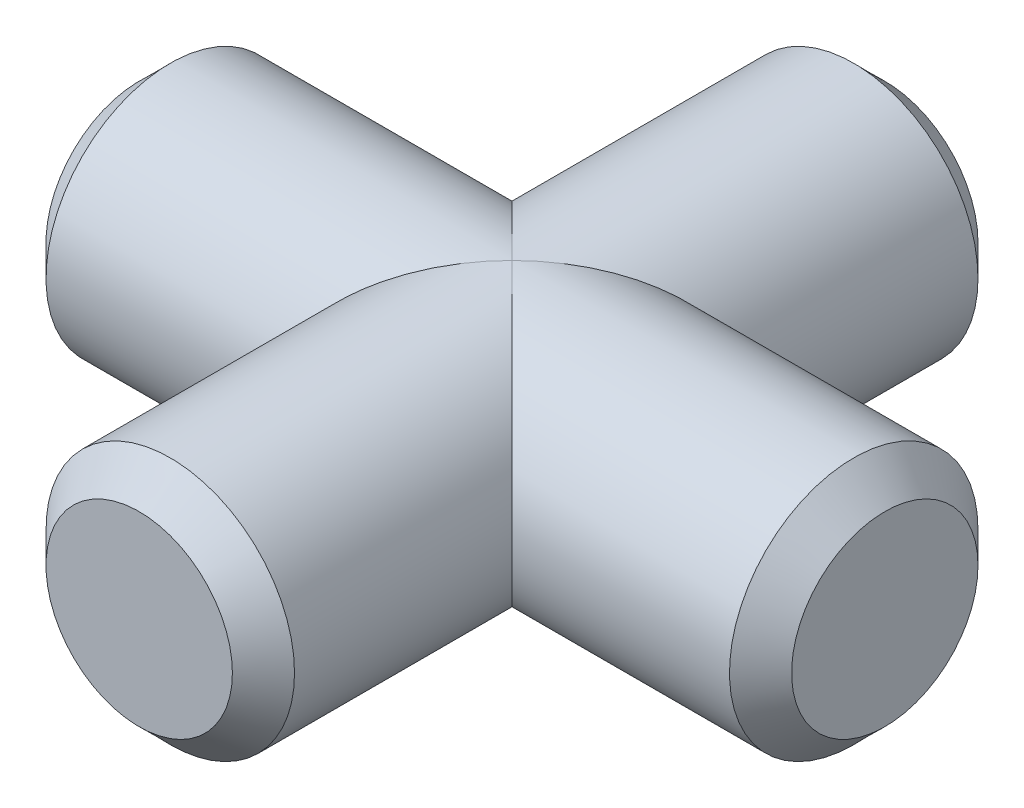
ISO-10303-21;
HEADER;
FILE_DESCRIPTION(('STEP AP214'),'2;1');
FILE_NAME('part.step','',(''),(''),'','','');
FILE_SCHEMA(('AUTOMOTIVE_DESIGN { 1 0 10303 214 1 1 1 1 }'));
ENDSEC;
DATA;
#1=APPLICATION_CONTEXT('core data for automotive mechanical design processes');
#2=APPLICATION_PROTOCOL_DEFINITION('international standard','automotive_design',2000,#1);
#3=PRODUCT_CONTEXT('',#1,'mechanical');
#4=PRODUCT('Part','Part','',(#3));
#5=PRODUCT_RELATED_PRODUCT_CATEGORY('part','',(#4));
#6=PRODUCT_DEFINITION_FORMATION('','',#4);
#7=PRODUCT_DEFINITION_CONTEXT('part definition',#1,'design');
#8=PRODUCT_DEFINITION('design','',#6,#7);
#9=PRODUCT_DEFINITION_SHAPE('','',#8);
#10=(LENGTH_UNIT() NAMED_UNIT(*) SI_UNIT(.MILLI.,.METRE.));
#11=(NAMED_UNIT(*) PLANE_ANGLE_UNIT() SI_UNIT($,.RADIAN.));
#12=(NAMED_UNIT(*) SI_UNIT($,.STERADIAN.) SOLID_ANGLE_UNIT());
#13=UNCERTAINTY_MEASURE_WITH_UNIT(LENGTH_MEASURE(1.E-05),#10,'distance_accuracy_value','');
#14=(GEOMETRIC_REPRESENTATION_CONTEXT(3) GLOBAL_UNCERTAINTY_ASSIGNED_CONTEXT((#13)) GLOBAL_UNIT_ASSIGNED_CONTEXT((#10,
#11,#12)) REPRESENTATION_CONTEXT('',''));
#15=CARTESIAN_POINT('',(0.,0.,0.));
#16=DIRECTION('',(0.,0.,1.));
#17=DIRECTION('',(1.,0.,0.));
#18=AXIS2_PLACEMENT_3D('',#15,#16,#17);
#19=CARTESIAN_POINT('',(0.,0.,12.));
#20=DIRECTION('',(0.,0.,-1.));
#21=DIRECTION('',(-1.,0.,0.));
#22=AXIS2_PLACEMENT_3D('',#19,#20,#21);
#23=CYLINDRICAL_SURFACE('',#22,2.);
#24=CARTESIAN_POINT('',(0.,0.,11.5));
#25=DIRECTION('',(0.,0.,1.));
#26=DIRECTION('',(1.,0.,0.));
#27=AXIS2_PLACEMENT_3D('',#24,#25,#26);
#28=CIRCLE('',#27,2.);
#29=CARTESIAN_POINT('',(2.,0.,11.5));
#30=VERTEX_POINT('',#29);
#31=EDGE_CURVE('E82',#30,#30,#28,.F.);
#32=ORIENTED_EDGE('',*,*,#31,.T.);
#33=EDGE_LOOP('',(#32));
#34=FACE_BOUND('',#33,.T.);
#35=CARTESIAN_POINT('',(0.,0.,6.));
#36=DIRECTION('',(-0.707106781186547,0.,-0.707106781186547));
#37=DIRECTION('',(0.707106781186547,0.,-0.707106781186547));
#38=AXIS2_PLACEMENT_3D('',#35,#36,#37);
#39=ELLIPSE('',#38,2.82842712474619,2.);
#40=CARTESIAN_POINT('',(0.,-2.,6.));
#41=VERTEX_POINT('',#40);
#42=CARTESIAN_POINT('',(0.,2.,6.));
#43=VERTEX_POINT('',#42);
#44=EDGE_CURVE('E54',#41,#43,#39,.T.);
#45=ORIENTED_EDGE('',*,*,#44,.F.);
#46=CARTESIAN_POINT('',(0.,0.,6.));
#47=DIRECTION('',(0.707106781186547,0.,-0.707106781186547));
#48=DIRECTION('',(-0.707106781186547,0.,-0.707106781186547));
#49=AXIS2_PLACEMENT_3D('',#46,#47,#48);
#50=ELLIPSE('',#49,2.82842712474619,2.);
#51=EDGE_CURVE('E53',#43,#41,#50,.T.);
#52=ORIENTED_EDGE('',*,*,#51,.F.);
#53=EDGE_LOOP('',(#45,#52));
#54=FACE_BOUND('',#53,.T.);
#55=ADVANCED_FACE('F33',(#34,#54),#23,.T.);
#56=CARTESIAN_POINT('',(0.,0.,12.));
#57=DIRECTION('',(0.,0.,1.));
#58=DIRECTION('',(1.,0.,0.));
#59=AXIS2_PLACEMENT_3D('',#56,#57,#58);
#60=PLANE('',#59);
#61=CARTESIAN_POINT('',(0.,0.,12.));
#62=DIRECTION('',(0.,0.,1.));
#63=DIRECTION('',(1.,0.,0.));
#64=AXIS2_PLACEMENT_3D('',#61,#62,#63);
#65=CIRCLE('',#64,1.5);
#66=CARTESIAN_POINT('',(1.5,0.,12.));
#67=VERTEX_POINT('',#66);
#68=EDGE_CURVE('E79',#67,#67,#65,.T.);
#69=ORIENTED_EDGE('',*,*,#68,.T.);
#70=EDGE_LOOP('',(#69));
#71=FACE_BOUND('',#70,.T.);
#72=ADVANCED_FACE('F98',(#71),#60,.T.);
#73=CARTESIAN_POINT('',(-6.,0.,6.));
#74=DIRECTION('',(1.,0.,0.));
#75=DIRECTION('',(0.,0.,-1.));
#76=AXIS2_PLACEMENT_3D('',#73,#74,#75);
#77=PLANE('',#76);
#78=CARTESIAN_POINT('',(-6.,0.,6.));
#79=DIRECTION('',(1.,0.,0.));
#80=DIRECTION('',(0.,0.,-1.));
#81=AXIS2_PLACEMENT_3D('',#78,#79,#80);
#82=CIRCLE('',#81,1.5);
#83=CARTESIAN_POINT('',(-6.,0.,4.5));
#84=VERTEX_POINT('',#83);
#85=EDGE_CURVE('E76',#84,#84,#82,.F.);
#86=ORIENTED_EDGE('',*,*,#85,.T.);
#87=EDGE_LOOP('',(#86));
#88=FACE_BOUND('',#87,.T.);
#89=ADVANCED_FACE('F105',(#88),#77,.F.);
#90=CARTESIAN_POINT('',(6.,0.,6.));
#91=DIRECTION('',(-1.,0.,0.));
#92=DIRECTION('',(0.,0.,1.));
#93=AXIS2_PLACEMENT_3D('',#90,#91,#92);
#94=CYLINDRICAL_SURFACE('',#93,2.);
#95=CARTESIAN_POINT('',(-5.5,0.,6.));
#96=DIRECTION('',(1.,0.,0.));
#97=DIRECTION('',(0.,0.,-1.));
#98=AXIS2_PLACEMENT_3D('',#95,#96,#97);
#99=CIRCLE('',#98,2.);
#100=CARTESIAN_POINT('',(-5.5,0.,4.));
#101=VERTEX_POINT('',#100);
#102=EDGE_CURVE('E73',#101,#101,#99,.T.);
#103=ORIENTED_EDGE('',*,*,#102,.T.);
#104=EDGE_LOOP('',(#103));
#105=FACE_BOUND('',#104,.T.);
#106=CARTESIAN_POINT('',(0.,0.,6.));
#107=DIRECTION('',(0.707106781186547,0.,-0.707106781186547));
#108=DIRECTION('',(-0.707106781186547,0.,-0.707106781186547));
#109=AXIS2_PLACEMENT_3D('',#106,#107,#108);
#110=ELLIPSE('',#109,2.82842712474619,2.);
#111=EDGE_CURVE('E47',#43,#41,#110,.F.);
#112=ORIENTED_EDGE('',*,*,#111,.T.);
#113=ORIENTED_EDGE('',*,*,#44,.T.);
#114=EDGE_LOOP('',(#112,#113));
#115=FACE_BOUND('',#114,.T.);
#116=ADVANCED_FACE('F62',(#105,#115),#94,.T.);
#117=CARTESIAN_POINT('',(0.,0.,0.));
#118=DIRECTION('',(0.,0.,1.));
#119=DIRECTION('',(1.,0.,0.));
#120=AXIS2_PLACEMENT_3D('',#117,#118,#119);
#121=PLANE('',#120);
#122=CARTESIAN_POINT('',(0.,0.,0.));
#123=DIRECTION('',(0.,0.,1.));
#124=DIRECTION('',(1.,0.,0.));
#125=AXIS2_PLACEMENT_3D('',#122,#123,#124);
#126=CIRCLE('',#125,1.5);
#127=CARTESIAN_POINT('',(1.5,0.,0.));
#128=VERTEX_POINT('',#127);
#129=EDGE_CURVE('E11',#128,#128,#126,.F.);
#130=ORIENTED_EDGE('',*,*,#129,.T.);
#131=EDGE_LOOP('',(#130));
#132=FACE_BOUND('',#131,.T.);
#133=ADVANCED_FACE('F111',(#132),#121,.F.);
#134=CARTESIAN_POINT('',(0.,0.,0.500000000000002));
#135=DIRECTION('',(0.,0.,1.));
#136=DIRECTION('',(1.,0.,0.));
#137=AXIS2_PLACEMENT_3D('',#134,#135,#136);
#138=CIRCLE('',#137,2.);
#139=CARTESIAN_POINT('',(2.,0.,0.500000000000002));
#140=VERTEX_POINT('',#139);
#141=EDGE_CURVE('E41',#140,#140,#138,.T.);
#142=ORIENTED_EDGE('',*,*,#141,.T.);
#143=EDGE_LOOP('',(#142));
#144=FACE_BOUND('',#143,.T.);
#145=CARTESIAN_POINT('',(0.,0.,6.));
#146=DIRECTION('',(-0.707106781186547,0.,-0.707106781186547));
#147=DIRECTION('',(0.707106781186547,0.,-0.707106781186547));
#148=AXIS2_PLACEMENT_3D('',#145,#146,#147);
#149=ELLIPSE('',#148,2.82842712474619,2.);
#150=EDGE_CURVE('E60',#41,#43,#149,.F.);
#151=ORIENTED_EDGE('',*,*,#150,.F.);
#152=ORIENTED_EDGE('',*,*,#111,.F.);
#153=EDGE_LOOP('',(#151,#152));
#154=FACE_BOUND('',#153,.T.);
#155=ADVANCED_FACE('F59',(#144,#154),#23,.T.);
#156=CARTESIAN_POINT('',(5.49999999999999,0.,6.));
#157=DIRECTION('',(1.,0.,0.));
#158=DIRECTION('',(0.,0.,-1.));
#159=AXIS2_PLACEMENT_3D('',#156,#157,#158);
#160=CIRCLE('',#159,2.);
#161=CARTESIAN_POINT('',(5.49999999999999,0.,4.));
#162=VERTEX_POINT('',#161);
#163=EDGE_CURVE('E68',#162,#162,#160,.F.);
#164=ORIENTED_EDGE('',*,*,#163,.T.);
#165=EDGE_LOOP('',(#164));
#166=FACE_BOUND('',#165,.T.);
#167=ORIENTED_EDGE('',*,*,#51,.T.);
#168=ORIENTED_EDGE('',*,*,#150,.T.);
#169=EDGE_LOOP('',(#167,#168));
#170=FACE_BOUND('',#169,.T.);
#171=ADVANCED_FACE('F64',(#166,#170),#94,.T.);
#172=CARTESIAN_POINT('',(6.,0.,6.));
#173=DIRECTION('',(1.,0.,0.));
#174=DIRECTION('',(0.,0.,-1.));
#175=AXIS2_PLACEMENT_3D('',#172,#173,#174);
#176=PLANE('',#175);
#177=CARTESIAN_POINT('',(6.,0.,6.));
#178=DIRECTION('',(1.,0.,0.));
#179=DIRECTION('',(0.,0.,-1.));
#180=AXIS2_PLACEMENT_3D('',#177,#178,#179);
#181=CIRCLE('',#180,1.5);
#182=CARTESIAN_POINT('',(6.,0.,4.5));
#183=VERTEX_POINT('',#182);
#184=EDGE_CURVE('E65',#183,#183,#181,.T.);
#185=ORIENTED_EDGE('',*,*,#184,.T.);
#186=EDGE_LOOP('',(#185));
#187=FACE_BOUND('',#186,.T.);
#188=ADVANCED_FACE('F117',(#187),#176,.T.);
#189=CARTESIAN_POINT('',(6.,0.,6.));
#190=DIRECTION('',(-1.,0.,0.));
#191=DIRECTION('',(0.,0.,1.));
#192=AXIS2_PLACEMENT_3D('',#189,#190,#191);
#193=CONICAL_SURFACE('',#192,1.5,0.785398163397445);
#194=ORIENTED_EDGE('',*,*,#163,.F.);
#195=EDGE_LOOP('',(#194));
#196=FACE_BOUND('',#195,.T.);
#197=ORIENTED_EDGE('',*,*,#184,.F.);
#198=EDGE_LOOP('',(#197));
#199=FACE_BOUND('',#198,.T.);
#200=ADVANCED_FACE('F130',(#196,#199),#193,.T.);
#201=CARTESIAN_POINT('',(-5.5,0.,6.));
#202=DIRECTION('',(1.,0.,0.));
#203=DIRECTION('',(0.,0.,-1.));
#204=AXIS2_PLACEMENT_3D('',#201,#202,#203);
#205=CONICAL_SURFACE('',#204,2.,0.78539816339745);
#206=ORIENTED_EDGE('',*,*,#85,.F.);
#207=EDGE_LOOP('',(#206));
#208=FACE_BOUND('',#207,.T.);
#209=ORIENTED_EDGE('',*,*,#102,.F.);
#210=EDGE_LOOP('',(#209));
#211=FACE_BOUND('',#210,.T.);
#212=ADVANCED_FACE('F94',(#208,#211),#205,.T.);
#213=CARTESIAN_POINT('',(0.,0.,12.));
#214=DIRECTION('',(0.,0.,-1.));
#215=DIRECTION('',(-1.,0.,0.));
#216=AXIS2_PLACEMENT_3D('',#213,#214,#215);
#217=CONICAL_SURFACE('',#216,1.5,0.785398163397445);
#218=ORIENTED_EDGE('',*,*,#31,.F.);
#219=EDGE_LOOP('',(#218));
#220=FACE_BOUND('',#219,.T.);
#221=ORIENTED_EDGE('',*,*,#68,.F.);
#222=EDGE_LOOP('',(#221));
#223=FACE_BOUND('',#222,.T.);
#224=ADVANCED_FACE('F89',(#220,#223),#217,.T.);
#225=CARTESIAN_POINT('',(0.,0.,0.500000000000002));
#226=DIRECTION('',(0.,0.,1.));
#227=DIRECTION('',(1.,0.,0.));
#228=AXIS2_PLACEMENT_3D('',#225,#226,#227);
#229=CONICAL_SURFACE('',#228,2.,0.78539816339745);
#230=ORIENTED_EDGE('',*,*,#129,.F.);
#231=EDGE_LOOP('',(#230));
#232=FACE_BOUND('',#231,.T.);
#233=ORIENTED_EDGE('',*,*,#141,.F.);
#234=EDGE_LOOP('',(#233));
#235=FACE_BOUND('',#234,.T.);
#236=ADVANCED_FACE('F35',(#232,#235),#229,.T.);
#237=CLOSED_SHELL('',(#55,#72,#89,#116,#133,#155,#171,#188,#200,#212,#224,#236));
#238=MANIFOLD_SOLID_BREP('B2',#237);
#239=ADVANCED_BREP_SHAPE_REPRESENTATION('',(#18,#238),#14);
#240=SHAPE_DEFINITION_REPRESENTATION(#9,#239);
ENDSEC;
END-ISO-10303-21;
